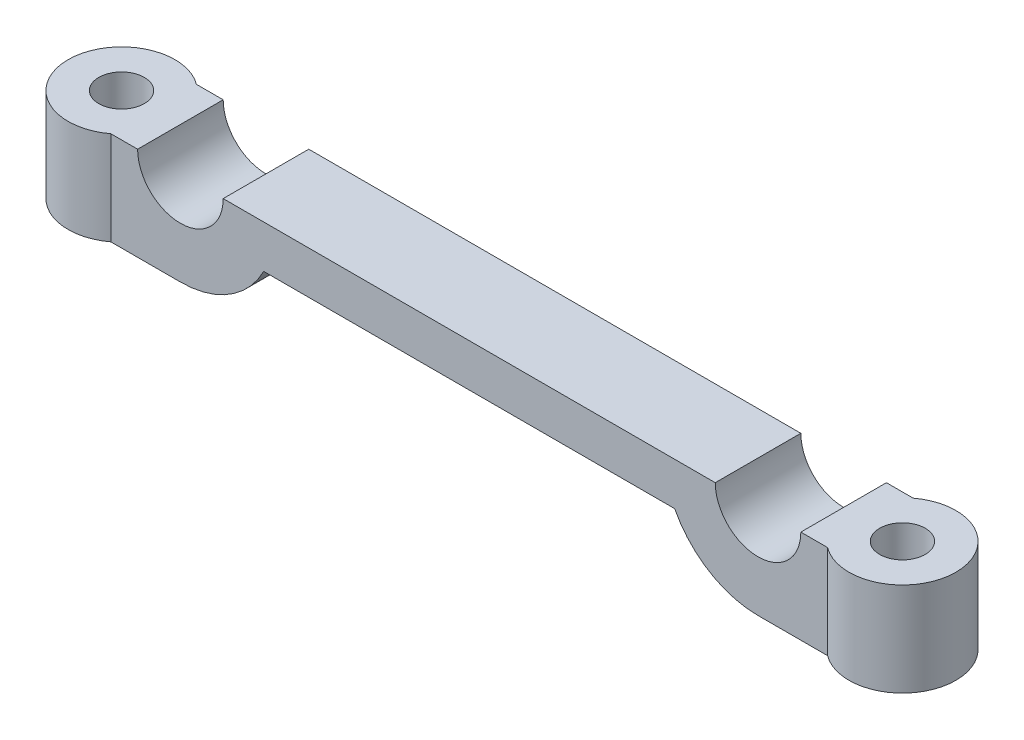
ISO-10303-21;
HEADER;
FILE_DESCRIPTION(('STEP AP214'),'2;1');
FILE_NAME('part.step','',(''),(''),'','','');
FILE_SCHEMA(('AUTOMOTIVE_DESIGN { 1 0 10303 214 1 1 1 1 }'));
ENDSEC;
DATA;
#1=APPLICATION_CONTEXT('core data for automotive mechanical design processes');
#2=APPLICATION_PROTOCOL_DEFINITION('international standard','automotive_design',2000,#1);
#3=PRODUCT_CONTEXT('',#1,'mechanical');
#4=PRODUCT('Part','Part','',(#3));
#5=PRODUCT_RELATED_PRODUCT_CATEGORY('part','',(#4));
#6=PRODUCT_DEFINITION_FORMATION('','',#4);
#7=PRODUCT_DEFINITION_CONTEXT('part definition',#1,'design');
#8=PRODUCT_DEFINITION('design','',#6,#7);
#9=PRODUCT_DEFINITION_SHAPE('','',#8);
#10=(LENGTH_UNIT() NAMED_UNIT(*) SI_UNIT(.MILLI.,.METRE.));
#11=(NAMED_UNIT(*) PLANE_ANGLE_UNIT() SI_UNIT($,.RADIAN.));
#12=(NAMED_UNIT(*) SI_UNIT($,.STERADIAN.) SOLID_ANGLE_UNIT());
#13=UNCERTAINTY_MEASURE_WITH_UNIT(LENGTH_MEASURE(1.E-05),#10,'distance_accuracy_value','');
#14=(GEOMETRIC_REPRESENTATION_CONTEXT(3) GLOBAL_UNCERTAINTY_ASSIGNED_CONTEXT((#13)) GLOBAL_UNIT_ASSIGNED_CONTEXT((#10,
#11,#12)) REPRESENTATION_CONTEXT('',''));
#15=CARTESIAN_POINT('',(0.,0.,0.));
#16=DIRECTION('',(0.,0.,1.));
#17=DIRECTION('',(1.,0.,0.));
#18=AXIS2_PLACEMENT_3D('',#15,#16,#17);
#19=CARTESIAN_POINT('',(57.94375,0.,0.));
#20=DIRECTION('',(0.,-1.,0.));
#21=DIRECTION('',(0.,0.,-1.));
#22=AXIS2_PLACEMENT_3D('',#19,#20,#21);
#23=PLANE('',#22);
#24=CARTESIAN_POINT('',(-57.94375,0.,0.));
#25=DIRECTION('',(0.,-1.,0.));
#26=DIRECTION('',(0.,0.,-1.));
#27=AXIS2_PLACEMENT_3D('',#24,#25,#26);
#28=CIRCLE('',#27,3.3782);
#29=CARTESIAN_POINT('',(-57.94375,0.,-3.3782));
#30=VERTEX_POINT('',#29);
#31=EDGE_CURVE('E285',#30,#30,#28,.T.);
#32=ORIENTED_EDGE('',*,*,#31,.F.);
#33=EDGE_LOOP('',(#32));
#34=FACE_BOUND('',#33,.T.);
#35=DIRECTION('',(-1.,0.,0.));
#36=VECTOR('',#35,1.);
#37=CARTESIAN_POINT('',(-53.18125,0.,-6.35));
#38=LINE('',#37,#36);
#39=CARTESIAN_POINT('',(-42.8625,0.,-6.35));
#40=VERTEX_POINT('',#39);
#41=CARTESIAN_POINT('',(-53.18125,0.,-6.35));
#42=VERTEX_POINT('',#41);
#43=EDGE_CURVE('E187',#40,#42,#38,.T.);
#44=ORIENTED_EDGE('',*,*,#43,.F.);
#45=DIRECTION('',(0.,0.,-1.));
#46=VECTOR('',#45,1.);
#47=CARTESIAN_POINT('',(-42.8625,0.,7.9375));
#48=LINE('',#47,#46);
#49=CARTESIAN_POINT('',(-42.8625,0.,6.35));
#50=VERTEX_POINT('',#49);
#51=EDGE_CURVE('E46',#40,#50,#48,.F.);
#52=ORIENTED_EDGE('',*,*,#51,.T.);
#53=DIRECTION('',(1.,0.,0.));
#54=VECTOR('',#53,1.);
#55=CARTESIAN_POINT('',(-53.18125,0.,6.35));
#56=LINE('',#55,#54);
#57=CARTESIAN_POINT('',(-53.18125,0.,6.35));
#58=VERTEX_POINT('',#57);
#59=EDGE_CURVE('E172',#58,#50,#56,.T.);
#60=ORIENTED_EDGE('',*,*,#59,.F.);
#61=CARTESIAN_POINT('',(-57.94375,0.,0.));
#62=DIRECTION('',(0.,1.,0.));
#63=DIRECTION('',(0.,0.,1.));
#64=AXIS2_PLACEMENT_3D('',#61,#62,#63);
#65=CIRCLE('',#64,7.9375);
#66=EDGE_CURVE('E190',#42,#58,#65,.T.);
#67=ORIENTED_EDGE('',*,*,#66,.F.);
#68=EDGE_LOOP('',(#44,#52,#60,#67));
#69=FACE_BOUND('',#68,.T.);
#70=ADVANCED_FACE('F38',(#34,#69),#23,.T.);
#71=CARTESIAN_POINT('',(57.94375,13.89888,0.));
#72=DIRECTION('',(0.,-1.,0.));
#73=DIRECTION('',(0.,0.,-1.));
#74=AXIS2_PLACEMENT_3D('',#71,#72,#73);
#75=PLANE('',#74);
#76=DIRECTION('',(-1.,0.,0.));
#77=VECTOR('',#76,1.);
#78=CARTESIAN_POINT('',(-53.18125,13.89888,-6.35));
#79=LINE('',#78,#77);
#80=CARTESIAN_POINT('',(36.5125,13.89888,-6.35));
#81=VERTEX_POINT('',#80);
#82=CARTESIAN_POINT('',(-36.5125,13.89888,-6.35));
#83=VERTEX_POINT('',#82);
#84=EDGE_CURVE('E177',#81,#83,#79,.T.);
#85=ORIENTED_EDGE('',*,*,#84,.T.);
#86=DIRECTION('',(0.,0.,1.));
#87=VECTOR('',#86,1.);
#88=CARTESIAN_POINT('',(-36.5125,13.89888,-7.9375));
#89=LINE('',#88,#87);
#90=CARTESIAN_POINT('',(-36.5125,13.89888,6.34999999999999));
#91=VERTEX_POINT('',#90);
#92=EDGE_CURVE('E214',#83,#91,#89,.T.);
#93=ORIENTED_EDGE('',*,*,#92,.T.);
#94=DIRECTION('',(1.,0.,0.));
#95=VECTOR('',#94,1.);
#96=CARTESIAN_POINT('',(-53.18125,13.89888,6.35));
#97=LINE('',#96,#95);
#98=CARTESIAN_POINT('',(36.5125,13.89888,6.34999999999999));
#99=VERTEX_POINT('',#98);
#100=EDGE_CURVE('E184',#91,#99,#97,.T.);
#101=ORIENTED_EDGE('',*,*,#100,.T.);
#102=DIRECTION('',(0.,0.,1.));
#103=VECTOR('',#102,1.);
#104=CARTESIAN_POINT('',(36.5125,13.89888,-7.9375));
#105=LINE('',#104,#103);
#106=EDGE_CURVE('E206',#99,#81,#105,.F.);
#107=ORIENTED_EDGE('',*,*,#106,.T.);
#108=EDGE_LOOP('',(#85,#93,#101,#107));
#109=FACE_BOUND('',#108,.T.);
#110=ADVANCED_FACE('F234',(#109),#75,.F.);
#111=CARTESIAN_POINT('',(57.94375,13.89888,0.));
#112=DIRECTION('',(0.,-1.,0.));
#113=DIRECTION('',(0.,0.,-1.));
#114=AXIS2_PLACEMENT_3D('',#111,#112,#113);
#115=CIRCLE('',#114,3.37819999999999);
#116=CARTESIAN_POINT('',(57.94375,13.89888,-3.37819999999999));
#117=VERTEX_POINT('',#116);
#118=EDGE_CURVE('E143',#117,#117,#115,.T.);
#119=ORIENTED_EDGE('',*,*,#118,.T.);
#120=EDGE_LOOP('',(#119));
#121=FACE_BOUND('',#120,.T.);
#122=CARTESIAN_POINT('',(53.18125,13.89888,-6.35));
#123=VERTEX_POINT('',#122);
#124=CARTESIAN_POINT('',(49.2125,13.89888,-6.35));
#125=VERTEX_POINT('',#124);
#126=EDGE_CURVE('E173',#123,#125,#79,.T.);
#127=ORIENTED_EDGE('',*,*,#126,.T.);
#128=DIRECTION('',(0.,0.,1.));
#129=VECTOR('',#128,1.);
#130=CARTESIAN_POINT('',(49.2125,13.89888,-7.9375));
#131=LINE('',#130,#129);
#132=CARTESIAN_POINT('',(49.2125,13.89888,6.34999999999999));
#133=VERTEX_POINT('',#132);
#134=EDGE_CURVE('E209',#125,#133,#131,.T.);
#135=ORIENTED_EDGE('',*,*,#134,.T.);
#136=CARTESIAN_POINT('',(53.18125,13.89888,6.35));
#137=VERTEX_POINT('',#136);
#138=EDGE_CURVE('E179',#133,#137,#97,.T.);
#139=ORIENTED_EDGE('',*,*,#138,.T.);
#140=CARTESIAN_POINT('',(57.94375,13.89888,0.));
#141=DIRECTION('',(0.,1.,0.));
#142=DIRECTION('',(0.,0.,-1.));
#143=AXIS2_PLACEMENT_3D('',#140,#141,#142);
#144=CIRCLE('',#143,7.9375);
#145=EDGE_CURVE('E168',#137,#123,#144,.T.);
#146=ORIENTED_EDGE('',*,*,#145,.T.);
#147=EDGE_LOOP('',(#127,#135,#139,#146));
#148=FACE_BOUND('',#147,.T.);
#149=ADVANCED_FACE('F239',(#121,#148),#75,.F.);
#150=CARTESIAN_POINT('',(57.94375,13.89888,0.));
#151=DIRECTION('',(0.,-1.,0.));
#152=DIRECTION('',(0.,0.,-1.));
#153=AXIS2_PLACEMENT_3D('',#150,#151,#152);
#154=CYLINDRICAL_SURFACE('',#153,7.9375);
#155=CARTESIAN_POINT('',(57.94375,0.,0.));
#156=DIRECTION('',(0.,1.,0.));
#157=DIRECTION('',(0.,0.,-1.));
#158=AXIS2_PLACEMENT_3D('',#155,#156,#157);
#159=CIRCLE('',#158,7.9375);
#160=CARTESIAN_POINT('',(53.18125,0.,6.35));
#161=VERTEX_POINT('',#160);
#162=CARTESIAN_POINT('',(53.18125,0.,-6.35));
#163=VERTEX_POINT('',#162);
#164=EDGE_CURVE('E167',#161,#163,#159,.T.);
#165=ORIENTED_EDGE('',*,*,#164,.T.);
#166=DIRECTION('',(0.,-1.,0.));
#167=VECTOR('',#166,1.);
#168=CARTESIAN_POINT('',(53.18125,13.89888,-6.35));
#169=LINE('',#168,#167);
#170=EDGE_CURVE('E203',#123,#163,#169,.T.);
#171=ORIENTED_EDGE('',*,*,#170,.F.);
#172=ORIENTED_EDGE('',*,*,#145,.F.);
#173=DIRECTION('',(0.,-1.,0.));
#174=VECTOR('',#173,1.);
#175=CARTESIAN_POINT('',(53.18125,13.89888,6.35));
#176=LINE('',#175,#174);
#177=EDGE_CURVE('E183',#137,#161,#176,.T.);
#178=ORIENTED_EDGE('',*,*,#177,.T.);
#179=EDGE_LOOP('',(#165,#171,#172,#178));
#180=FACE_BOUND('',#179,.T.);
#181=ADVANCED_FACE('F40',(#180),#154,.T.);
#182=CARTESIAN_POINT('',(-53.18125,13.89888,-6.35));
#183=DIRECTION('',(0.,0.,1.));
#184=DIRECTION('',(1.,0.,0.));
#185=AXIS2_PLACEMENT_3D('',#182,#183,#184);
#186=PLANE('',#185);
#187=DIRECTION('',(1.,0.,0.));
#188=VECTOR('',#187,1.);
#189=CARTESIAN_POINT('',(-30.4989905769276,7.54887999999999,-6.35));
#190=LINE('',#189,#188);
#191=CARTESIAN_POINT('',(-30.4989905769276,7.54887999999999,-6.35));
#192=VERTEX_POINT('',#191);
#193=CARTESIAN_POINT('',(30.4989905769276,7.54887999999999,-6.35));
#194=VERTEX_POINT('',#193);
#195=EDGE_CURVE('E132',#192,#194,#190,.T.);
#196=ORIENTED_EDGE('',*,*,#195,.F.);
#197=CARTESIAN_POINT('',(-42.8625,13.89888,-6.35));
#198=DIRECTION('',(0.,0.,1.));
#199=DIRECTION('',(1.,0.,0.));
#200=AXIS2_PLACEMENT_3D('',#197,#198,#199);
#201=CIRCLE('',#200,13.89888);
#202=EDGE_CURVE('E138',#40,#192,#201,.T.);
#203=ORIENTED_EDGE('',*,*,#202,.F.);
#204=ORIENTED_EDGE('',*,*,#43,.T.);
#205=DIRECTION('',(0.,-1.,0.));
#206=VECTOR('',#205,1.);
#207=CARTESIAN_POINT('',(-53.18125,13.89888,-6.35));
#208=LINE('',#207,#206);
#209=CARTESIAN_POINT('',(-53.18125,13.89888,-6.35));
#210=VERTEX_POINT('',#209);
#211=EDGE_CURVE('E200',#210,#42,#208,.T.);
#212=ORIENTED_EDGE('',*,*,#211,.F.);
#213=CARTESIAN_POINT('',(-49.2125,13.89888,-6.35));
#214=VERTEX_POINT('',#213);
#215=EDGE_CURVE('E171',#214,#210,#79,.T.);
#216=ORIENTED_EDGE('',*,*,#215,.F.);
#217=CARTESIAN_POINT('',(-42.8625,13.89888,-6.35));
#218=DIRECTION('',(0.,0.,1.));
#219=DIRECTION('',(1.,0.,0.));
#220=AXIS2_PLACEMENT_3D('',#217,#218,#219);
#221=CIRCLE('',#220,6.35);
#222=EDGE_CURVE('E61',#214,#83,#221,.T.);
#223=ORIENTED_EDGE('',*,*,#222,.T.);
#224=ORIENTED_EDGE('',*,*,#84,.F.);
#225=CARTESIAN_POINT('',(42.8625,13.89888,-6.35));
#226=DIRECTION('',(0.,0.,1.));
#227=DIRECTION('',(1.,0.,0.));
#228=AXIS2_PLACEMENT_3D('',#225,#226,#227);
#229=CIRCLE('',#228,6.35);
#230=EDGE_CURVE('E160',#81,#125,#229,.T.);
#231=ORIENTED_EDGE('',*,*,#230,.T.);
#232=ORIENTED_EDGE('',*,*,#126,.F.);
#233=ORIENTED_EDGE('',*,*,#170,.T.);
#234=CARTESIAN_POINT('',(42.8625,0.,-6.35));
#235=VERTEX_POINT('',#234);
#236=EDGE_CURVE('E188',#163,#235,#38,.T.);
#237=ORIENTED_EDGE('',*,*,#236,.T.);
#238=CARTESIAN_POINT('',(42.8625,13.89888,-6.35));
#239=DIRECTION('',(0.,0.,1.));
#240=DIRECTION('',(-1.,0.,0.));
#241=AXIS2_PLACEMENT_3D('',#238,#239,#240);
#242=CIRCLE('',#241,13.89888);
#243=EDGE_CURVE('E53',#194,#235,#242,.T.);
#244=ORIENTED_EDGE('',*,*,#243,.F.);
#245=EDGE_LOOP('',(#196,#203,#204,#212,#216,#223,#224,#231,#232,#233,#237,#244));
#246=FACE_BOUND('',#245,.T.);
#247=ADVANCED_FACE('F145',(#246),#186,.F.);
#248=CARTESIAN_POINT('',(-57.94375,13.89888,0.));
#249=DIRECTION('',(0.,-1.,0.));
#250=DIRECTION('',(0.,0.,-1.));
#251=AXIS2_PLACEMENT_3D('',#248,#249,#250);
#252=CYLINDRICAL_SURFACE('',#251,7.9375);
#253=ORIENTED_EDGE('',*,*,#66,.T.);
#254=DIRECTION('',(0.,-1.,0.));
#255=VECTOR('',#254,1.);
#256=CARTESIAN_POINT('',(-53.18125,13.89888,6.35));
#257=LINE('',#256,#255);
#258=CARTESIAN_POINT('',(-53.18125,13.89888,6.35));
#259=VERTEX_POINT('',#258);
#260=EDGE_CURVE('E197',#259,#58,#257,.T.);
#261=ORIENTED_EDGE('',*,*,#260,.F.);
#262=CARTESIAN_POINT('',(-57.94375,13.89888,0.));
#263=DIRECTION('',(0.,1.,0.));
#264=DIRECTION('',(0.,0.,1.));
#265=AXIS2_PLACEMENT_3D('',#262,#263,#264);
#266=CIRCLE('',#265,7.9375);
#267=EDGE_CURVE('E176',#210,#259,#266,.T.);
#268=ORIENTED_EDGE('',*,*,#267,.F.);
#269=ORIENTED_EDGE('',*,*,#211,.T.);
#270=EDGE_LOOP('',(#253,#261,#268,#269));
#271=FACE_BOUND('',#270,.T.);
#272=ADVANCED_FACE('F227',(#271),#252,.T.);
#273=CARTESIAN_POINT('',(-53.18125,13.89888,6.35));
#274=DIRECTION('',(0.,0.,-1.));
#275=DIRECTION('',(-1.,0.,0.));
#276=AXIS2_PLACEMENT_3D('',#273,#274,#275);
#277=PLANE('',#276);
#278=ORIENTED_EDGE('',*,*,#59,.T.);
#279=CARTESIAN_POINT('',(-42.8625,13.89888,6.35));
#280=DIRECTION('',(0.,0.,-1.));
#281=DIRECTION('',(-1.,0.,0.));
#282=AXIS2_PLACEMENT_3D('',#279,#280,#281);
#283=CIRCLE('',#282,13.89888);
#284=CARTESIAN_POINT('',(-30.4989905769276,7.54887999999999,6.35));
#285=VERTEX_POINT('',#284);
#286=EDGE_CURVE('E155',#50,#285,#283,.F.);
#287=ORIENTED_EDGE('',*,*,#286,.T.);
#288=DIRECTION('',(1.,0.,0.));
#289=VECTOR('',#288,1.);
#290=CARTESIAN_POINT('',(-53.18125,7.54887999999999,6.35));
#291=LINE('',#290,#289);
#292=CARTESIAN_POINT('',(30.4989905769276,7.54887999999999,6.35));
#293=VERTEX_POINT('',#292);
#294=EDGE_CURVE('E11',#285,#293,#291,.T.);
#295=ORIENTED_EDGE('',*,*,#294,.T.);
#296=CARTESIAN_POINT('',(42.8625,13.89888,6.35));
#297=DIRECTION('',(0.,0.,-1.));
#298=DIRECTION('',(-1.,0.,0.));
#299=AXIS2_PLACEMENT_3D('',#296,#297,#298);
#300=CIRCLE('',#299,13.89888);
#301=CARTESIAN_POINT('',(42.8625,0.,6.35));
#302=VERTEX_POINT('',#301);
#303=EDGE_CURVE('E151',#293,#302,#300,.F.);
#304=ORIENTED_EDGE('',*,*,#303,.T.);
#305=EDGE_CURVE('E192',#302,#161,#56,.T.);
#306=ORIENTED_EDGE('',*,*,#305,.T.);
#307=ORIENTED_EDGE('',*,*,#177,.F.);
#308=ORIENTED_EDGE('',*,*,#138,.F.);
#309=CARTESIAN_POINT('',(42.8625,13.89888,6.35));
#310=DIRECTION('',(0.,0.,-1.));
#311=DIRECTION('',(-1.,0.,0.));
#312=AXIS2_PLACEMENT_3D('',#309,#310,#311);
#313=CIRCLE('',#312,6.35);
#314=EDGE_CURVE('E157',#133,#99,#313,.T.);
#315=ORIENTED_EDGE('',*,*,#314,.T.);
#316=ORIENTED_EDGE('',*,*,#100,.F.);
#317=CARTESIAN_POINT('',(-42.8625,13.89888,6.35));
#318=DIRECTION('',(0.,0.,-1.));
#319=DIRECTION('',(-1.,0.,0.));
#320=AXIS2_PLACEMENT_3D('',#317,#318,#319);
#321=CIRCLE('',#320,6.35);
#322=CARTESIAN_POINT('',(-49.2125,13.89888,6.34999999999999));
#323=VERTEX_POINT('',#322);
#324=EDGE_CURVE('E163',#91,#323,#321,.T.);
#325=ORIENTED_EDGE('',*,*,#324,.T.);
#326=EDGE_CURVE('E180',#259,#323,#97,.T.);
#327=ORIENTED_EDGE('',*,*,#326,.F.);
#328=ORIENTED_EDGE('',*,*,#260,.T.);
#329=EDGE_LOOP('',(#278,#287,#295,#304,#306,#307,#308,#315,#316,#325,#327,#328));
#330=FACE_BOUND('',#329,.T.);
#331=ADVANCED_FACE('F222',(#330),#277,.F.);
#332=CARTESIAN_POINT('',(-57.94375,13.89888,0.));
#333=DIRECTION('',(0.,-1.,0.));
#334=DIRECTION('',(0.,0.,-1.));
#335=AXIS2_PLACEMENT_3D('',#332,#333,#334);
#336=CIRCLE('',#335,3.3782);
#337=CARTESIAN_POINT('',(-57.94375,13.89888,-3.3782));
#338=VERTEX_POINT('',#337);
#339=EDGE_CURVE('E281',#338,#338,#336,.T.);
#340=ORIENTED_EDGE('',*,*,#339,.T.);
#341=EDGE_LOOP('',(#340));
#342=FACE_BOUND('',#341,.T.);
#343=ORIENTED_EDGE('',*,*,#326,.T.);
#344=DIRECTION('',(0.,0.,1.));
#345=VECTOR('',#344,1.);
#346=CARTESIAN_POINT('',(-49.2125,13.89888,-7.9375));
#347=LINE('',#346,#345);
#348=EDGE_CURVE('E212',#323,#214,#347,.F.);
#349=ORIENTED_EDGE('',*,*,#348,.T.);
#350=ORIENTED_EDGE('',*,*,#215,.T.);
#351=ORIENTED_EDGE('',*,*,#267,.T.);
#352=EDGE_LOOP('',(#343,#349,#350,#351));
#353=FACE_BOUND('',#352,.T.);
#354=ADVANCED_FACE('F250',(#342,#353),#75,.F.);
#355=CARTESIAN_POINT('',(57.94375,0.,0.));
#356=DIRECTION('',(0.,-1.,0.));
#357=DIRECTION('',(0.,0.,-1.));
#358=AXIS2_PLACEMENT_3D('',#355,#356,#357);
#359=CIRCLE('',#358,3.3782);
#360=CARTESIAN_POINT('',(57.94375,0.,-3.3782));
#361=VERTEX_POINT('',#360);
#362=EDGE_CURVE('E279',#361,#361,#359,.T.);
#363=ORIENTED_EDGE('',*,*,#362,.F.);
#364=EDGE_LOOP('',(#363));
#365=FACE_BOUND('',#364,.T.);
#366=DIRECTION('',(0.,0.,-1.));
#367=VECTOR('',#366,1.);
#368=CARTESIAN_POINT('',(42.8625,0.,7.9375));
#369=LINE('',#368,#367);
#370=EDGE_CURVE('E217',#235,#302,#369,.F.);
#371=ORIENTED_EDGE('',*,*,#370,.F.);
#372=ORIENTED_EDGE('',*,*,#236,.F.);
#373=ORIENTED_EDGE('',*,*,#164,.F.);
#374=ORIENTED_EDGE('',*,*,#305,.F.);
#375=EDGE_LOOP('',(#371,#372,#373,#374));
#376=FACE_BOUND('',#375,.T.);
#377=ADVANCED_FACE('F247',(#365,#376),#23,.T.);
#378=CARTESIAN_POINT('',(42.8625,13.89888,-7.9375));
#379=DIRECTION('',(0.,0.,1.));
#380=DIRECTION('',(1.,0.,0.));
#381=AXIS2_PLACEMENT_3D('',#378,#379,#380);
#382=CYLINDRICAL_SURFACE('',#381,6.35);
#383=ORIENTED_EDGE('',*,*,#106,.F.);
#384=ORIENTED_EDGE('',*,*,#314,.F.);
#385=ORIENTED_EDGE('',*,*,#134,.F.);
#386=ORIENTED_EDGE('',*,*,#230,.F.);
#387=EDGE_LOOP('',(#383,#384,#385,#386));
#388=FACE_BOUND('',#387,.T.);
#389=ADVANCED_FACE('F253',(#388),#382,.F.);
#390=CARTESIAN_POINT('',(-42.8625,13.89888,-7.9375));
#391=DIRECTION('',(0.,0.,1.));
#392=DIRECTION('',(1.,0.,0.));
#393=AXIS2_PLACEMENT_3D('',#390,#391,#392);
#394=CYLINDRICAL_SURFACE('',#393,6.35);
#395=ORIENTED_EDGE('',*,*,#348,.F.);
#396=ORIENTED_EDGE('',*,*,#324,.F.);
#397=ORIENTED_EDGE('',*,*,#92,.F.);
#398=ORIENTED_EDGE('',*,*,#222,.F.);
#399=EDGE_LOOP('',(#395,#396,#397,#398));
#400=FACE_BOUND('',#399,.T.);
#401=ADVANCED_FACE('F251',(#400),#394,.F.);
#402=CARTESIAN_POINT('',(-30.4989905769276,7.54887999999999,7.9375));
#403=DIRECTION('',(0.,1.,0.));
#404=DIRECTION('',(0.,0.,1.));
#405=AXIS2_PLACEMENT_3D('',#402,#403,#404);
#406=PLANE('',#405);
#407=DIRECTION('',(0.,0.,-1.));
#408=VECTOR('',#407,1.);
#409=CARTESIAN_POINT('',(-30.4989905769276,7.54887999999999,7.9375));
#410=LINE('',#409,#408);
#411=EDGE_CURVE('E127',#285,#192,#410,.T.);
#412=ORIENTED_EDGE('',*,*,#411,.T.);
#413=ORIENTED_EDGE('',*,*,#195,.T.);
#414=DIRECTION('',(0.,0.,-1.));
#415=VECTOR('',#414,1.);
#416=CARTESIAN_POINT('',(30.4989905769276,7.54887999999999,7.9375));
#417=LINE('',#416,#415);
#418=EDGE_CURVE('E135',#293,#194,#417,.T.);
#419=ORIENTED_EDGE('',*,*,#418,.F.);
#420=ORIENTED_EDGE('',*,*,#294,.F.);
#421=EDGE_LOOP('',(#412,#413,#419,#420));
#422=FACE_BOUND('',#421,.T.);
#423=ADVANCED_FACE('F129',(#422),#406,.F.);
#424=CARTESIAN_POINT('',(-42.8625,13.89888,7.9375));
#425=DIRECTION('',(0.,0.,-1.));
#426=DIRECTION('',(-1.,0.,0.));
#427=AXIS2_PLACEMENT_3D('',#424,#425,#426);
#428=CYLINDRICAL_SURFACE('',#427,13.89888);
#429=ORIENTED_EDGE('',*,*,#51,.F.);
#430=ORIENTED_EDGE('',*,*,#202,.T.);
#431=ORIENTED_EDGE('',*,*,#411,.F.);
#432=ORIENTED_EDGE('',*,*,#286,.F.);
#433=EDGE_LOOP('',(#429,#430,#431,#432));
#434=FACE_BOUND('',#433,.T.);
#435=ADVANCED_FACE('F139',(#434),#428,.T.);
#436=CARTESIAN_POINT('',(42.8625,13.89888,7.9375));
#437=DIRECTION('',(0.,0.,-1.));
#438=DIRECTION('',(-1.,0.,0.));
#439=AXIS2_PLACEMENT_3D('',#436,#437,#438);
#440=CYLINDRICAL_SURFACE('',#439,13.89888);
#441=ORIENTED_EDGE('',*,*,#418,.T.);
#442=ORIENTED_EDGE('',*,*,#243,.T.);
#443=ORIENTED_EDGE('',*,*,#370,.T.);
#444=ORIENTED_EDGE('',*,*,#303,.F.);
#445=EDGE_LOOP('',(#441,#442,#443,#444));
#446=FACE_BOUND('',#445,.T.);
#447=ADVANCED_FACE('F249',(#446),#440,.T.);
#448=CARTESIAN_POINT('',(57.94375,0.,0.));
#449=DIRECTION('',(0.,-1.,0.));
#450=DIRECTION('',(0.,0.,-1.));
#451=AXIS2_PLACEMENT_3D('',#448,#449,#450);
#452=CYLINDRICAL_SURFACE('',#451,3.37819999999999);
#453=ORIENTED_EDGE('',*,*,#118,.F.);
#454=EDGE_LOOP('',(#453));
#455=FACE_BOUND('',#454,.T.);
#456=ORIENTED_EDGE('',*,*,#362,.T.);
#457=EDGE_LOOP('',(#456));
#458=FACE_BOUND('',#457,.T.);
#459=ADVANCED_FACE('F292',(#455,#458),#452,.F.);
#460=CARTESIAN_POINT('',(-57.94375,0.,0.));
#461=DIRECTION('',(0.,-1.,0.));
#462=DIRECTION('',(0.,0.,-1.));
#463=AXIS2_PLACEMENT_3D('',#460,#461,#462);
#464=CYLINDRICAL_SURFACE('',#463,3.3782);
#465=ORIENTED_EDGE('',*,*,#339,.F.);
#466=EDGE_LOOP('',(#465));
#467=FACE_BOUND('',#466,.T.);
#468=ORIENTED_EDGE('',*,*,#31,.T.);
#469=EDGE_LOOP('',(#468));
#470=FACE_BOUND('',#469,.T.);
#471=ADVANCED_FACE('F290',(#467,#470),#464,.F.);
#472=CLOSED_SHELL('',(#70,#110,#149,#181,#247,#272,#331,#354,#377,#389,#401,#423,#435,#447,#459,#471));
#473=MANIFOLD_SOLID_BREP('B2',#472);
#474=ADVANCED_BREP_SHAPE_REPRESENTATION('',(#18,#473),#14);
#475=SHAPE_DEFINITION_REPRESENTATION(#9,#474);
ENDSEC;
END-ISO-10303-21;
